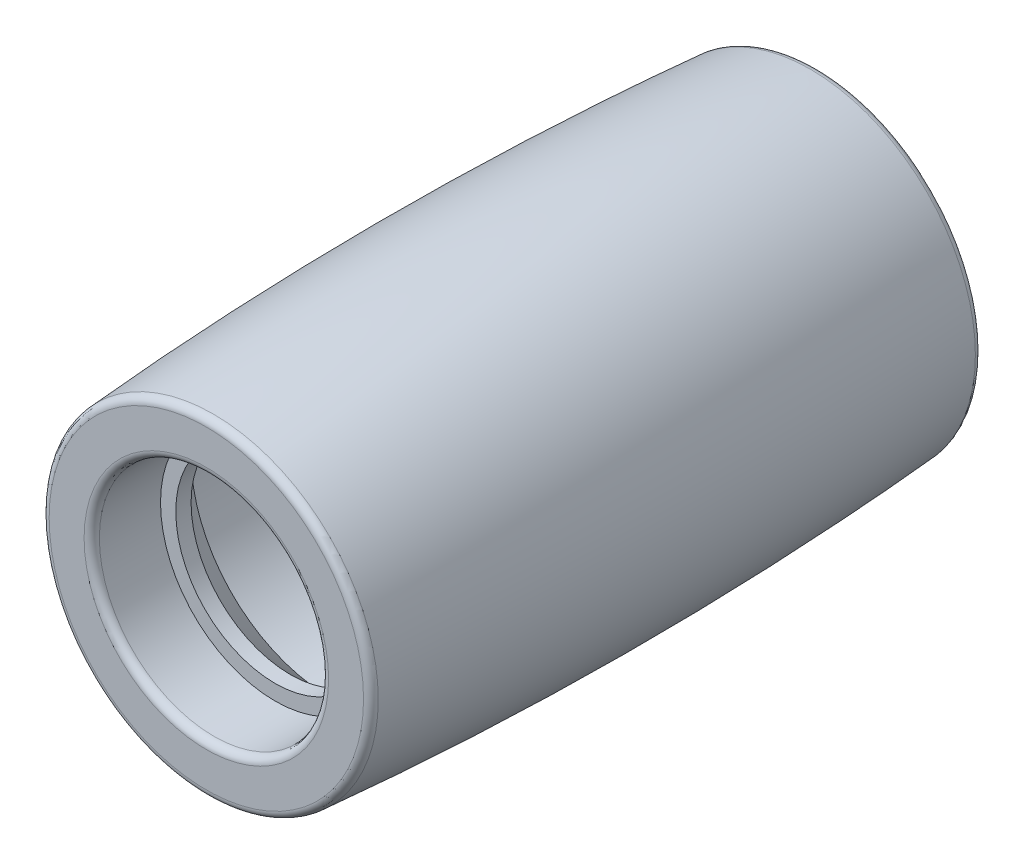
ISO-10303-21;
HEADER;
FILE_DESCRIPTION(('STEP AP214'),'2;1');
FILE_NAME('part.step','',(''),(''),'','','');
FILE_SCHEMA(('AUTOMOTIVE_DESIGN { 1 0 10303 214 1 1 1 1 }'));
ENDSEC;
DATA;
#1=APPLICATION_CONTEXT('core data for automotive mechanical design processes');
#2=APPLICATION_PROTOCOL_DEFINITION('international standard','automotive_design',2000,#1);
#3=PRODUCT_CONTEXT('',#1,'mechanical');
#4=PRODUCT('Part','Part','',(#3));
#5=PRODUCT_RELATED_PRODUCT_CATEGORY('part','',(#4));
#6=PRODUCT_DEFINITION_FORMATION('','',#4);
#7=PRODUCT_DEFINITION_CONTEXT('part definition',#1,'design');
#8=PRODUCT_DEFINITION('design','',#6,#7);
#9=PRODUCT_DEFINITION_SHAPE('','',#8);
#10=(LENGTH_UNIT() NAMED_UNIT(*) SI_UNIT(.MILLI.,.METRE.));
#11=(NAMED_UNIT(*) PLANE_ANGLE_UNIT() SI_UNIT($,.RADIAN.));
#12=(NAMED_UNIT(*) SI_UNIT($,.STERADIAN.) SOLID_ANGLE_UNIT());
#13=UNCERTAINTY_MEASURE_WITH_UNIT(LENGTH_MEASURE(1.E-05),#10,'distance_accuracy_value','');
#14=(GEOMETRIC_REPRESENTATION_CONTEXT(3) GLOBAL_UNCERTAINTY_ASSIGNED_CONTEXT((#13)) GLOBAL_UNIT_ASSIGNED_CONTEXT((#10,
#11,#12)) REPRESENTATION_CONTEXT('',''));
#15=CARTESIAN_POINT('',(0.,0.,0.));
#16=DIRECTION('',(0.,0.,1.));
#17=DIRECTION('',(1.,0.,0.));
#18=AXIS2_PLACEMENT_3D('',#15,#16,#17);
#19=CARTESIAN_POINT('',(0.,0.,-49.5));
#20=DIRECTION('',(0.,0.,1.));
#21=DIRECTION('',(1.,0.,0.));
#22=AXIS2_PLACEMENT_3D('',#19,#20,#21);
#23=DEGENERATE_TOROIDAL_SURFACE('',#22,511.083333333333,534.083333333333,.F.);
#24=CARTESIAN_POINT('',(0.,0.,-88.5731592934188));
#25=DIRECTION('',(0.,0.,1.));
#26=DIRECTION('',(1.,0.,0.));
#27=AXIS2_PLACEMENT_3D('',#24,#25,#26);
#28=CIRCLE('',#27,21.5688000213313);
#29=CARTESIAN_POINT('',(21.5688000213313,0.,-88.5731592934188));
#30=VERTEX_POINT('',#29);
#31=EDGE_CURVE('E69',#30,#30,#28,.T.);
#32=ORIENTED_EDGE('',*,*,#31,.T.);
#33=EDGE_LOOP('',(#32));
#34=FACE_BOUND('',#33,.T.);
#35=CARTESIAN_POINT('',(0.,0.,-10.4268407065812));
#36=DIRECTION('',(0.,0.,-1.));
#37=DIRECTION('',(-1.,0.,0.));
#38=AXIS2_PLACEMENT_3D('',#35,#36,#37);
#39=CIRCLE('',#38,21.5688000213313);
#40=CARTESIAN_POINT('',(-21.5688000213313,0.,-10.4268407065812));
#41=VERTEX_POINT('',#40);
#42=EDGE_CURVE('E73',#41,#41,#39,.T.);
#43=ORIENTED_EDGE('',*,*,#42,.T.);
#44=EDGE_LOOP('',(#43));
#45=FACE_BOUND('',#44,.T.);
#46=ADVANCED_FACE('F43',(#34,#45),#23,.F.);
#47=CARTESIAN_POINT('',(0.,21.5,-9.49999999999999));
#48=DIRECTION('',(0.,0.,-1.));
#49=DIRECTION('',(-1.,0.,0.));
#50=AXIS2_PLACEMENT_3D('',#47,#48,#49);
#51=PLANE('',#50);
#52=CARTESIAN_POINT('',(0.,0.,-9.49999999999999));
#53=DIRECTION('',(0.,0.,-1.));
#54=DIRECTION('',(-1.,0.,0.));
#55=AXIS2_PLACEMENT_3D('',#52,#53,#54);
#56=CIRCLE('',#55,20.5714797529187);
#57=CARTESIAN_POINT('',(-20.5714797529187,0.,-9.49999999999999));
#58=VERTEX_POINT('',#57);
#59=EDGE_CURVE('E51',#58,#58,#56,.F.);
#60=ORIENTED_EDGE('',*,*,#59,.T.);
#61=EDGE_LOOP('',(#60));
#62=FACE_BOUND('',#61,.T.);
#63=CARTESIAN_POINT('',(0.,0.,-9.49999999999999));
#64=DIRECTION('',(0.,0.,-1.));
#65=DIRECTION('',(-1.,0.,0.));
#66=AXIS2_PLACEMENT_3D('',#63,#64,#65);
#67=CIRCLE('',#66,16.);
#68=CARTESIAN_POINT('',(-16.,0.,-9.49999999999999));
#69=VERTEX_POINT('',#68);
#70=EDGE_CURVE('E58',#69,#69,#67,.T.);
#71=ORIENTED_EDGE('',*,*,#70,.T.);
#72=EDGE_LOOP('',(#71));
#73=FACE_BOUND('',#72,.T.);
#74=ADVANCED_FACE('F188',(#62,#73),#51,.F.);
#75=CARTESIAN_POINT('',(0.,0.,0.));
#76=DIRECTION('',(0.,0.,1.));
#77=DIRECTION('',(1.,0.,0.));
#78=AXIS2_PLACEMENT_3D('',#75,#76,#77);
#79=CYLINDRICAL_SURFACE('',#78,15.);
#80=CARTESIAN_POINT('',(0.,0.,-10.5));
#81=DIRECTION('',(0.,0.,-1.));
#82=DIRECTION('',(-1.,0.,0.));
#83=AXIS2_PLACEMENT_3D('',#80,#81,#82);
#84=CIRCLE('',#83,15.);
#85=CARTESIAN_POINT('',(-15.,0.,-10.5));
#86=VERTEX_POINT('',#85);
#87=EDGE_CURVE('E10',#86,#86,#84,.F.);
#88=ORIENTED_EDGE('',*,*,#87,.T.);
#89=EDGE_LOOP('',(#88));
#90=FACE_BOUND('',#89,.T.);
#91=CARTESIAN_POINT('',(0.,0.,-18.5));
#92=DIRECTION('',(0.,0.,1.));
#93=DIRECTION('',(1.,0.,0.));
#94=AXIS2_PLACEMENT_3D('',#91,#92,#93);
#95=CIRCLE('',#94,15.);
#96=CARTESIAN_POINT('',(15.,0.,-18.5));
#97=VERTEX_POINT('',#96);
#98=EDGE_CURVE('E76',#97,#97,#95,.T.);
#99=ORIENTED_EDGE('',*,*,#98,.F.);
#100=EDGE_LOOP('',(#99));
#101=FACE_BOUND('',#100,.T.);
#102=ADVANCED_FACE('F183',(#90,#101),#79,.F.);
#103=CARTESIAN_POINT('',(0.,15.,-18.5));
#104=DIRECTION('',(0.,0.,-1.));
#105=DIRECTION('',(-1.,0.,0.));
#106=AXIS2_PLACEMENT_3D('',#103,#104,#105);
#107=PLANE('',#106);
#108=CARTESIAN_POINT('',(0.,0.,-18.5));
#109=DIRECTION('',(0.,0.,1.));
#110=DIRECTION('',(1.,0.,0.));
#111=AXIS2_PLACEMENT_3D('',#108,#109,#110);
#112=CIRCLE('',#111,13.);
#113=CARTESIAN_POINT('',(13.,0.,-18.5));
#114=VERTEX_POINT('',#113);
#115=EDGE_CURVE('E92',#114,#114,#112,.T.);
#116=ORIENTED_EDGE('',*,*,#115,.F.);
#117=EDGE_LOOP('',(#116));
#118=FACE_BOUND('',#117,.T.);
#119=ORIENTED_EDGE('',*,*,#98,.T.);
#120=EDGE_LOOP('',(#119));
#121=FACE_BOUND('',#120,.T.);
#122=ADVANCED_FACE('F177',(#118,#121),#107,.F.);
#123=CARTESIAN_POINT('',(0.,0.,0.));
#124=DIRECTION('',(0.,0.,1.));
#125=DIRECTION('',(1.,0.,0.));
#126=AXIS2_PLACEMENT_3D('',#123,#124,#125);
#127=CYLINDRICAL_SURFACE('',#126,13.);
#128=CARTESIAN_POINT('',(0.,0.,-20.5));
#129=DIRECTION('',(0.,0.,1.));
#130=DIRECTION('',(1.,0.,0.));
#131=AXIS2_PLACEMENT_3D('',#128,#129,#130);
#132=CIRCLE('',#131,13.);
#133=CARTESIAN_POINT('',(13.,0.,-20.5));
#134=VERTEX_POINT('',#133);
#135=EDGE_CURVE('E96',#134,#134,#132,.T.);
#136=ORIENTED_EDGE('',*,*,#135,.F.);
#137=EDGE_LOOP('',(#136));
#138=FACE_BOUND('',#137,.T.);
#139=ORIENTED_EDGE('',*,*,#115,.T.);
#140=EDGE_LOOP('',(#139));
#141=FACE_BOUND('',#140,.T.);
#142=ADVANCED_FACE('F171',(#138,#141),#127,.F.);
#143=CARTESIAN_POINT('',(0.,0.,-20.5));
#144=DIRECTION('',(0.,0.,-1.));
#145=DIRECTION('',(-1.,0.,0.));
#146=AXIS2_PLACEMENT_3D('',#143,#144,#145);
#147=CONICAL_SURFACE('',#146,13.,0.78539816339745);
#148=CARTESIAN_POINT('',(0.,0.,-25.75));
#149=DIRECTION('',(0.,0.,1.));
#150=DIRECTION('',(1.,0.,0.));
#151=AXIS2_PLACEMENT_3D('',#148,#149,#150);
#152=CIRCLE('',#151,18.25);
#153=CARTESIAN_POINT('',(18.25,0.,-25.75));
#154=VERTEX_POINT('',#153);
#155=EDGE_CURVE('E100',#154,#154,#152,.T.);
#156=ORIENTED_EDGE('',*,*,#155,.F.);
#157=EDGE_LOOP('',(#156));
#158=FACE_BOUND('',#157,.T.);
#159=ORIENTED_EDGE('',*,*,#135,.T.);
#160=EDGE_LOOP('',(#159));
#161=FACE_BOUND('',#160,.T.);
#162=ADVANCED_FACE('F165',(#158,#161),#147,.F.);
#163=CARTESIAN_POINT('',(0.,0.,0.));
#164=DIRECTION('',(0.,0.,1.));
#165=DIRECTION('',(1.,0.,0.));
#166=AXIS2_PLACEMENT_3D('',#163,#164,#165);
#167=CYLINDRICAL_SURFACE('',#166,18.25);
#168=CARTESIAN_POINT('',(0.,0.,-39.3));
#169=DIRECTION('',(0.,0.,1.));
#170=DIRECTION('',(1.,0.,0.));
#171=AXIS2_PLACEMENT_3D('',#168,#169,#170);
#172=CIRCLE('',#171,18.25);
#173=CARTESIAN_POINT('',(18.25,0.,-39.3));
#174=VERTEX_POINT('',#173);
#175=EDGE_CURVE('E104',#174,#174,#172,.T.);
#176=ORIENTED_EDGE('',*,*,#175,.F.);
#177=EDGE_LOOP('',(#176));
#178=FACE_BOUND('',#177,.T.);
#179=ORIENTED_EDGE('',*,*,#155,.T.);
#180=EDGE_LOOP('',(#179));
#181=FACE_BOUND('',#180,.T.);
#182=ADVANCED_FACE('F151',(#178,#181),#167,.F.);
#183=CARTESIAN_POINT('',(0.,11.,-39.3));
#184=DIRECTION('',(0.,0.,-1.));
#185=DIRECTION('',(-1.,0.,0.));
#186=AXIS2_PLACEMENT_3D('',#183,#184,#185);
#187=PLANE('',#186);
#188=CARTESIAN_POINT('',(-14.,1.46642216231412E-13,-39.3));
#189=DIRECTION('',(0.,0.,1.));
#190=DIRECTION('',(1.,0.,0.));
#191=AXIS2_PLACEMENT_3D('',#188,#189,#190);
#192=CIRCLE('',#191,1.8);
#193=CARTESIAN_POINT('',(-12.2,1.46642216231412E-13,-39.3));
#194=VERTEX_POINT('',#193);
#195=EDGE_CURVE('E81',#194,#194,#192,.T.);
#196=ORIENTED_EDGE('',*,*,#195,.F.);
#197=EDGE_LOOP('',(#196));
#198=FACE_BOUND('',#197,.T.);
#199=CARTESIAN_POINT('',(0.,-14.,-39.3));
#200=DIRECTION('',(0.,0.,1.));
#201=DIRECTION('',(1.,0.,0.));
#202=AXIS2_PLACEMENT_3D('',#199,#200,#201);
#203=CIRCLE('',#202,1.8);
#204=CARTESIAN_POINT('',(1.8,-14.,-39.3));
#205=VERTEX_POINT('',#204);
#206=EDGE_CURVE('E80',#205,#205,#203,.T.);
#207=ORIENTED_EDGE('',*,*,#206,.F.);
#208=EDGE_LOOP('',(#207));
#209=FACE_BOUND('',#208,.T.);
#210=CARTESIAN_POINT('',(14.,0.,-39.3));
#211=DIRECTION('',(0.,0.,1.));
#212=DIRECTION('',(1.,0.,0.));
#213=AXIS2_PLACEMENT_3D('',#210,#211,#212);
#214=CIRCLE('',#213,1.8);
#215=CARTESIAN_POINT('',(15.8,0.,-39.3));
#216=VERTEX_POINT('',#215);
#217=EDGE_CURVE('E85',#216,#216,#214,.T.);
#218=ORIENTED_EDGE('',*,*,#217,.F.);
#219=EDGE_LOOP('',(#218));
#220=FACE_BOUND('',#219,.T.);
#221=CARTESIAN_POINT('',(0.,14.,-39.3));
#222=DIRECTION('',(0.,0.,1.));
#223=DIRECTION('',(1.,0.,0.));
#224=AXIS2_PLACEMENT_3D('',#221,#222,#223);
#225=CIRCLE('',#224,1.8);
#226=CARTESIAN_POINT('',(1.8,14.,-39.3));
#227=VERTEX_POINT('',#226);
#228=EDGE_CURVE('E89',#227,#227,#225,.T.);
#229=ORIENTED_EDGE('',*,*,#228,.F.);
#230=EDGE_LOOP('',(#229));
#231=FACE_BOUND('',#230,.T.);
#232=CARTESIAN_POINT('',(0.,0.,-39.3));
#233=DIRECTION('',(0.,0.,1.));
#234=DIRECTION('',(1.,0.,0.));
#235=AXIS2_PLACEMENT_3D('',#232,#233,#234);
#236=CIRCLE('',#235,11.);
#237=CARTESIAN_POINT('',(11.,0.,-39.3));
#238=VERTEX_POINT('',#237);
#239=EDGE_CURVE('E108',#238,#238,#236,.T.);
#240=ORIENTED_EDGE('',*,*,#239,.F.);
#241=EDGE_LOOP('',(#240));
#242=FACE_BOUND('',#241,.T.);
#243=ORIENTED_EDGE('',*,*,#175,.T.);
#244=EDGE_LOOP('',(#243));
#245=FACE_BOUND('',#244,.T.);
#246=ADVANCED_FACE('F147',(#198,#209,#220,#231,#242,#245),#187,.F.);
#247=CARTESIAN_POINT('',(0.,0.,0.));
#248=DIRECTION('',(0.,0.,1.));
#249=DIRECTION('',(1.,0.,0.));
#250=AXIS2_PLACEMENT_3D('',#247,#248,#249);
#251=CYLINDRICAL_SURFACE('',#250,11.);
#252=CARTESIAN_POINT('',(0.,0.,-42.3));
#253=DIRECTION('',(0.,0.,1.));
#254=DIRECTION('',(1.,0.,0.));
#255=AXIS2_PLACEMENT_3D('',#252,#253,#254);
#256=CIRCLE('',#255,11.);
#257=CARTESIAN_POINT('',(11.,0.,-42.3));
#258=VERTEX_POINT('',#257);
#259=EDGE_CURVE('E112',#258,#258,#256,.T.);
#260=ORIENTED_EDGE('',*,*,#259,.F.);
#261=EDGE_LOOP('',(#260));
#262=FACE_BOUND('',#261,.T.);
#263=ORIENTED_EDGE('',*,*,#239,.T.);
#264=EDGE_LOOP('',(#263));
#265=FACE_BOUND('',#264,.T.);
#266=ADVANCED_FACE('F150',(#262,#265),#251,.F.);
#267=CARTESIAN_POINT('',(0.,18.25,-42.3));
#268=DIRECTION('',(0.,0.,1.));
#269=DIRECTION('',(1.,0.,0.));
#270=AXIS2_PLACEMENT_3D('',#267,#268,#269);
#271=PLANE('',#270);
#272=CARTESIAN_POINT('',(-14.,1.46642216231412E-13,-42.3));
#273=DIRECTION('',(0.,0.,1.));
#274=DIRECTION('',(1.,0.,0.));
#275=AXIS2_PLACEMENT_3D('',#272,#273,#274);
#276=CIRCLE('',#275,1.8);
#277=CARTESIAN_POINT('',(-12.2,1.46642216231412E-13,-42.3));
#278=VERTEX_POINT('',#277);
#279=EDGE_CURVE('E77',#278,#278,#276,.T.);
#280=ORIENTED_EDGE('',*,*,#279,.T.);
#281=EDGE_LOOP('',(#280));
#282=FACE_BOUND('',#281,.T.);
#283=CARTESIAN_POINT('',(0.,-14.,-42.3));
#284=DIRECTION('',(0.,0.,1.));
#285=DIRECTION('',(1.,0.,0.));
#286=AXIS2_PLACEMENT_3D('',#283,#284,#285);
#287=CIRCLE('',#286,1.8);
#288=CARTESIAN_POINT('',(1.8,-14.,-42.3));
#289=VERTEX_POINT('',#288);
#290=EDGE_CURVE('E82',#289,#289,#287,.T.);
#291=ORIENTED_EDGE('',*,*,#290,.T.);
#292=EDGE_LOOP('',(#291));
#293=FACE_BOUND('',#292,.T.);
#294=CARTESIAN_POINT('',(14.,0.,-42.3));
#295=DIRECTION('',(0.,0.,1.));
#296=DIRECTION('',(1.,0.,0.));
#297=AXIS2_PLACEMENT_3D('',#294,#295,#296);
#298=CIRCLE('',#297,1.8);
#299=CARTESIAN_POINT('',(15.8,0.,-42.3));
#300=VERTEX_POINT('',#299);
#301=EDGE_CURVE('E86',#300,#300,#298,.T.);
#302=ORIENTED_EDGE('',*,*,#301,.T.);
#303=EDGE_LOOP('',(#302));
#304=FACE_BOUND('',#303,.T.);
#305=CARTESIAN_POINT('',(0.,14.,-42.3));
#306=DIRECTION('',(0.,0.,1.));
#307=DIRECTION('',(1.,0.,0.));
#308=AXIS2_PLACEMENT_3D('',#305,#306,#307);
#309=CIRCLE('',#308,1.8);
#310=CARTESIAN_POINT('',(1.8,14.,-42.3));
#311=VERTEX_POINT('',#310);
#312=EDGE_CURVE('E132',#311,#311,#309,.T.);
#313=ORIENTED_EDGE('',*,*,#312,.T.);
#314=EDGE_LOOP('',(#313));
#315=FACE_BOUND('',#314,.T.);
#316=CARTESIAN_POINT('',(0.,0.,-42.3));
#317=DIRECTION('',(0.,0.,1.));
#318=DIRECTION('',(1.,0.,0.));
#319=AXIS2_PLACEMENT_3D('',#316,#317,#318);
#320=CIRCLE('',#319,18.25);
#321=CARTESIAN_POINT('',(18.25,0.,-42.3));
#322=VERTEX_POINT('',#321);
#323=EDGE_CURVE('E116',#322,#322,#320,.T.);
#324=ORIENTED_EDGE('',*,*,#323,.F.);
#325=EDGE_LOOP('',(#324));
#326=FACE_BOUND('',#325,.T.);
#327=ORIENTED_EDGE('',*,*,#259,.T.);
#328=EDGE_LOOP('',(#327));
#329=FACE_BOUND('',#328,.T.);
#330=ADVANCED_FACE('F285',(#282,#293,#304,#315,#326,#329),#271,.F.);
#331=CARTESIAN_POINT('',(0.,0.,0.));
#332=DIRECTION('',(0.,0.,1.));
#333=DIRECTION('',(1.,0.,0.));
#334=AXIS2_PLACEMENT_3D('',#331,#332,#333);
#335=CYLINDRICAL_SURFACE('',#334,18.25);
#336=CARTESIAN_POINT('',(0.,0.,-81.));
#337=DIRECTION('',(0.,0.,1.));
#338=DIRECTION('',(1.,0.,0.));
#339=AXIS2_PLACEMENT_3D('',#336,#337,#338);
#340=CIRCLE('',#339,18.25);
#341=CARTESIAN_POINT('',(18.25,0.,-81.));
#342=VERTEX_POINT('',#341);
#343=EDGE_CURVE('E120',#342,#342,#340,.T.);
#344=ORIENTED_EDGE('',*,*,#343,.F.);
#345=EDGE_LOOP('',(#344));
#346=FACE_BOUND('',#345,.T.);
#347=ORIENTED_EDGE('',*,*,#323,.T.);
#348=EDGE_LOOP('',(#347));
#349=FACE_BOUND('',#348,.T.);
#350=ADVANCED_FACE('F290',(#346,#349),#335,.F.);
#351=CARTESIAN_POINT('',(0.,0.,-81.));
#352=DIRECTION('',(0.,0.,-1.));
#353=DIRECTION('',(-1.,0.,0.));
#354=AXIS2_PLACEMENT_3D('',#351,#352,#353);
#355=CONICAL_SURFACE('',#354,18.25,0.436332312998583);
#356=CARTESIAN_POINT('',(0.,0.,-83.1445069205095));
#357=DIRECTION('',(0.,0.,1.));
#358=DIRECTION('',(1.,0.,0.));
#359=AXIS2_PLACEMENT_3D('',#356,#357,#358);
#360=CIRCLE('',#359,19.25);
#361=CARTESIAN_POINT('',(19.25,0.,-83.1445069205095));
#362=VERTEX_POINT('',#361);
#363=EDGE_CURVE('E124',#362,#362,#360,.T.);
#364=ORIENTED_EDGE('',*,*,#363,.F.);
#365=EDGE_LOOP('',(#364));
#366=FACE_BOUND('',#365,.T.);
#367=ORIENTED_EDGE('',*,*,#343,.T.);
#368=EDGE_LOOP('',(#367));
#369=FACE_BOUND('',#368,.T.);
#370=ADVANCED_FACE('F314',(#366,#369),#355,.F.);
#371=CARTESIAN_POINT('',(0.,0.,0.));
#372=DIRECTION('',(0.,0.,1.));
#373=DIRECTION('',(1.,0.,0.));
#374=AXIS2_PLACEMENT_3D('',#371,#372,#373);
#375=CYLINDRICAL_SURFACE('',#374,19.25);
#376=CARTESIAN_POINT('',(0.,0.,-89.5));
#377=DIRECTION('',(0.,0.,1.));
#378=DIRECTION('',(1.,0.,0.));
#379=AXIS2_PLACEMENT_3D('',#376,#377,#378);
#380=CIRCLE('',#379,19.25);
#381=CARTESIAN_POINT('',(19.25,0.,-89.5));
#382=VERTEX_POINT('',#381);
#383=EDGE_CURVE('E128',#382,#382,#380,.T.);
#384=ORIENTED_EDGE('',*,*,#383,.F.);
#385=EDGE_LOOP('',(#384));
#386=FACE_BOUND('',#385,.T.);
#387=ORIENTED_EDGE('',*,*,#363,.T.);
#388=EDGE_LOOP('',(#387));
#389=FACE_BOUND('',#388,.T.);
#390=ADVANCED_FACE('F235',(#386,#389),#375,.F.);
#391=CARTESIAN_POINT('',(0.,21.5,-89.5));
#392=DIRECTION('',(0.,0.,1.));
#393=DIRECTION('',(1.,0.,0.));
#394=AXIS2_PLACEMENT_3D('',#391,#392,#393);
#395=PLANE('',#394);
#396=CARTESIAN_POINT('',(0.,0.,-89.5));
#397=DIRECTION('',(0.,0.,1.));
#398=DIRECTION('',(1.,0.,0.));
#399=AXIS2_PLACEMENT_3D('',#396,#397,#398);
#400=CIRCLE('',#399,20.5714797529187);
#401=CARTESIAN_POINT('',(20.5714797529187,0.,-89.5));
#402=VERTEX_POINT('',#401);
#403=EDGE_CURVE('E63',#402,#402,#400,.F.);
#404=ORIENTED_EDGE('',*,*,#403,.T.);
#405=EDGE_LOOP('',(#404));
#406=FACE_BOUND('',#405,.T.);
#407=ORIENTED_EDGE('',*,*,#383,.T.);
#408=EDGE_LOOP('',(#407));
#409=FACE_BOUND('',#408,.T.);
#410=ADVANCED_FACE('F231',(#406,#409),#395,.F.);
#411=CARTESIAN_POINT('',(0.,14.,-39.3));
#412=DIRECTION('',(0.,0.,1.));
#413=DIRECTION('',(1.,0.,0.));
#414=AXIS2_PLACEMENT_3D('',#411,#412,#413);
#415=CYLINDRICAL_SURFACE('',#414,1.8);
#416=ORIENTED_EDGE('',*,*,#228,.T.);
#417=EDGE_LOOP('',(#416));
#418=FACE_BOUND('',#417,.T.);
#419=ORIENTED_EDGE('',*,*,#312,.F.);
#420=EDGE_LOOP('',(#419));
#421=FACE_BOUND('',#420,.T.);
#422=ADVANCED_FACE('F234',(#418,#421),#415,.F.);
#423=CARTESIAN_POINT('',(14.,0.,-39.3));
#424=DIRECTION('',(0.,0.,1.));
#425=DIRECTION('',(1.,0.,0.));
#426=AXIS2_PLACEMENT_3D('',#423,#424,#425);
#427=CYLINDRICAL_SURFACE('',#426,1.8);
#428=ORIENTED_EDGE('',*,*,#217,.T.);
#429=EDGE_LOOP('',(#428));
#430=FACE_BOUND('',#429,.T.);
#431=ORIENTED_EDGE('',*,*,#301,.F.);
#432=EDGE_LOOP('',(#431));
#433=FACE_BOUND('',#432,.T.);
#434=ADVANCED_FACE('F271',(#430,#433),#427,.F.);
#435=CARTESIAN_POINT('',(0.,-14.,-39.3));
#436=DIRECTION('',(0.,0.,1.));
#437=DIRECTION('',(1.,0.,0.));
#438=AXIS2_PLACEMENT_3D('',#435,#436,#437);
#439=CYLINDRICAL_SURFACE('',#438,1.8);
#440=ORIENTED_EDGE('',*,*,#206,.T.);
#441=EDGE_LOOP('',(#440));
#442=FACE_BOUND('',#441,.T.);
#443=ORIENTED_EDGE('',*,*,#290,.F.);
#444=EDGE_LOOP('',(#443));
#445=FACE_BOUND('',#444,.T.);
#446=ADVANCED_FACE('F263',(#442,#445),#439,.F.);
#447=CARTESIAN_POINT('',(-14.,1.46642216231412E-13,-39.3));
#448=DIRECTION('',(0.,0.,1.));
#449=DIRECTION('',(1.,0.,0.));
#450=AXIS2_PLACEMENT_3D('',#447,#448,#449);
#451=CYLINDRICAL_SURFACE('',#450,1.8);
#452=ORIENTED_EDGE('',*,*,#195,.T.);
#453=EDGE_LOOP('',(#452));
#454=FACE_BOUND('',#453,.T.);
#455=ORIENTED_EDGE('',*,*,#279,.F.);
#456=EDGE_LOOP('',(#455));
#457=FACE_BOUND('',#456,.T.);
#458=ADVANCED_FACE('F144',(#454,#457),#451,.F.);
#459=CARTESIAN_POINT('',(0.,0.,-88.5));
#460=DIRECTION('',(0.,0.,1.));
#461=DIRECTION('',(1.,0.,0.));
#462=AXIS2_PLACEMENT_3D('',#459,#460,#461);
#463=TOROIDAL_SURFACE('',#462,20.5714797529187,1.);
#464=ORIENTED_EDGE('',*,*,#403,.F.);
#465=EDGE_LOOP('',(#464));
#466=FACE_BOUND('',#465,.T.);
#467=ORIENTED_EDGE('',*,*,#31,.F.);
#468=EDGE_LOOP('',(#467));
#469=FACE_BOUND('',#468,.T.);
#470=ADVANCED_FACE('F200',(#466,#469),#463,.T.);
#471=CARTESIAN_POINT('',(0.,0.,-10.5));
#472=DIRECTION('',(0.,0.,-1.));
#473=DIRECTION('',(-1.,0.,0.));
#474=AXIS2_PLACEMENT_3D('',#471,#472,#473);
#475=TOROIDAL_SURFACE('',#474,20.5714797529187,1.);
#476=ORIENTED_EDGE('',*,*,#42,.F.);
#477=EDGE_LOOP('',(#476));
#478=FACE_BOUND('',#477,.T.);
#479=ORIENTED_EDGE('',*,*,#59,.F.);
#480=EDGE_LOOP('',(#479));
#481=FACE_BOUND('',#480,.T.);
#482=ADVANCED_FACE('F202',(#478,#481),#475,.T.);
#483=CARTESIAN_POINT('',(0.,0.,-10.5));
#484=DIRECTION('',(0.,0.,-1.));
#485=DIRECTION('',(-1.,0.,0.));
#486=AXIS2_PLACEMENT_3D('',#483,#484,#485);
#487=TOROIDAL_SURFACE('',#486,16.,1.);
#488=ORIENTED_EDGE('',*,*,#70,.F.);
#489=EDGE_LOOP('',(#488));
#490=FACE_BOUND('',#489,.T.);
#491=ORIENTED_EDGE('',*,*,#87,.F.);
#492=EDGE_LOOP('',(#491));
#493=FACE_BOUND('',#492,.T.);
#494=ADVANCED_FACE('F45',(#490,#493),#487,.T.);
#495=CLOSED_SHELL('',(#46,#74,#102,#122,#142,#162,#182,#246,#266,#330,#350,#370,#390,#410,#422,
#434,#446,#458,#470,#482,#494));
#496=MANIFOLD_SOLID_BREP('B2',#495);
#497=ADVANCED_BREP_SHAPE_REPRESENTATION('',(#18,#496),#14);
#498=SHAPE_DEFINITION_REPRESENTATION(#9,#497);
ENDSEC;
END-ISO-10303-21;
